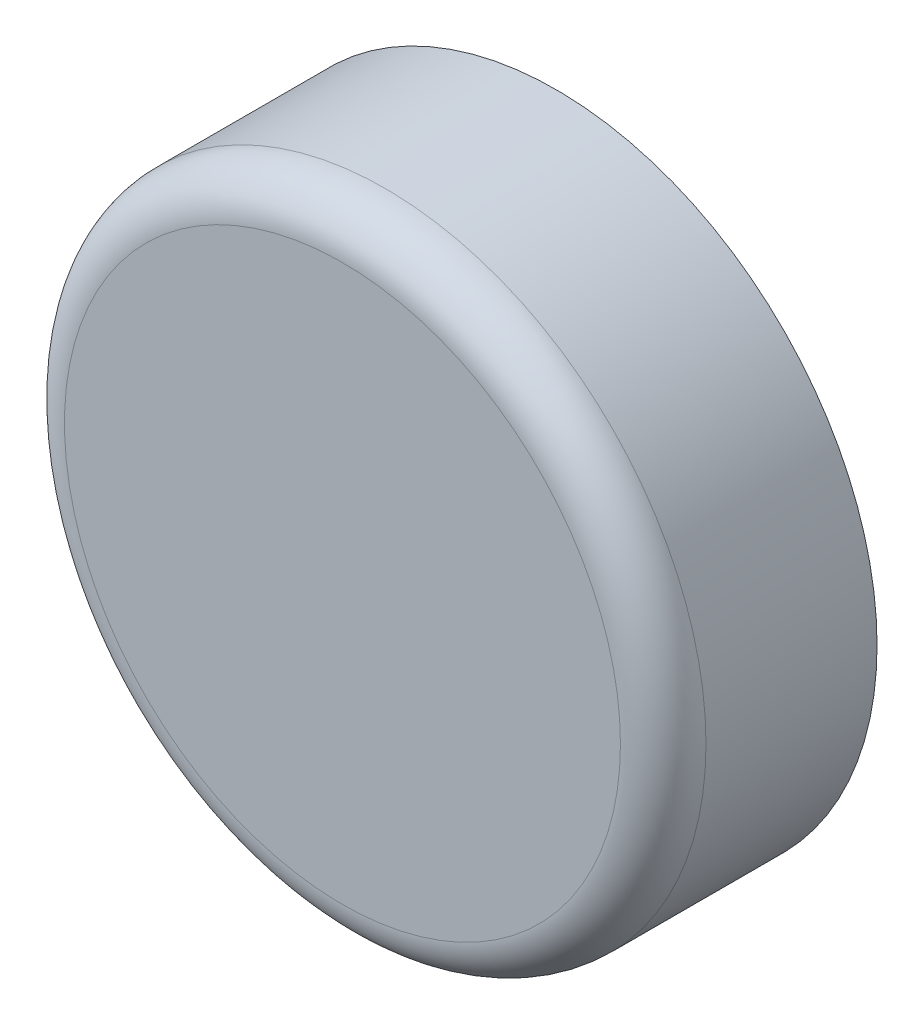
ISO-10303-21;
HEADER;
FILE_DESCRIPTION(('STEP AP214'),'2;1');
FILE_NAME('part.step','',(''),(''),'','','');
FILE_SCHEMA(('AUTOMOTIVE_DESIGN { 1 0 10303 214 1 1 1 1 }'));
ENDSEC;
DATA;
#1=APPLICATION_CONTEXT('core data for automotive mechanical design processes');
#2=APPLICATION_PROTOCOL_DEFINITION('international standard','automotive_design',2000,#1);
#3=PRODUCT_CONTEXT('',#1,'mechanical');
#4=PRODUCT('Part','Part','',(#3));
#5=PRODUCT_RELATED_PRODUCT_CATEGORY('part','',(#4));
#6=PRODUCT_DEFINITION_FORMATION('','',#4);
#7=PRODUCT_DEFINITION_CONTEXT('part definition',#1,'design');
#8=PRODUCT_DEFINITION('design','',#6,#7);
#9=PRODUCT_DEFINITION_SHAPE('','',#8);
#10=(LENGTH_UNIT() NAMED_UNIT(*) SI_UNIT(.MILLI.,.METRE.));
#11=(NAMED_UNIT(*) PLANE_ANGLE_UNIT() SI_UNIT($,.RADIAN.));
#12=(NAMED_UNIT(*) SI_UNIT($,.STERADIAN.) SOLID_ANGLE_UNIT());
#13=UNCERTAINTY_MEASURE_WITH_UNIT(LENGTH_MEASURE(1.E-05),#10,'distance_accuracy_value','');
#14=(GEOMETRIC_REPRESENTATION_CONTEXT(3) GLOBAL_UNCERTAINTY_ASSIGNED_CONTEXT((#13)) GLOBAL_UNIT_ASSIGNED_CONTEXT((#10,
#11,#12)) REPRESENTATION_CONTEXT('',''));
#15=CARTESIAN_POINT('',(0.,0.,0.));
#16=DIRECTION('',(0.,0.,1.));
#17=DIRECTION('',(1.,0.,0.));
#18=AXIS2_PLACEMENT_3D('',#15,#16,#17);
#19=CARTESIAN_POINT('',(0.,0.,10.));
#20=DIRECTION('',(0.,0.,-1.));
#21=DIRECTION('',(-1.,0.,0.));
#22=AXIS2_PLACEMENT_3D('',#19,#20,#21);
#23=CYLINDRICAL_SURFACE('',#22,15.);
#24=CARTESIAN_POINT('',(0.,0.,8.));
#25=DIRECTION('',(0.,0.,1.));
#26=DIRECTION('',(1.,0.,0.));
#27=AXIS2_PLACEMENT_3D('',#24,#25,#26);
#28=CIRCLE('',#27,15.);
#29=CARTESIAN_POINT('',(15.,0.,8.));
#30=VERTEX_POINT('',#29);
#31=EDGE_CURVE('E10',#30,#30,#28,.F.);
#32=ORIENTED_EDGE('',*,*,#31,.T.);
#33=EDGE_LOOP('',(#32));
#34=FACE_BOUND('',#33,.T.);
#35=CARTESIAN_POINT('',(0.,0.,0.));
#36=DIRECTION('',(0.,0.,1.));
#37=DIRECTION('',(1.,0.,0.));
#38=AXIS2_PLACEMENT_3D('',#35,#36,#37);
#39=CIRCLE('',#38,15.);
#40=CARTESIAN_POINT('',(15.,0.,0.));
#41=VERTEX_POINT('',#40);
#42=EDGE_CURVE('E50',#41,#41,#39,.T.);
#43=ORIENTED_EDGE('',*,*,#42,.T.);
#44=EDGE_LOOP('',(#43));
#45=FACE_BOUND('',#44,.T.);
#46=ADVANCED_FACE('F37',(#34,#45),#23,.T.);
#47=CARTESIAN_POINT('',(0.,0.,10.));
#48=DIRECTION('',(0.,0.,1.));
#49=DIRECTION('',(1.,0.,0.));
#50=AXIS2_PLACEMENT_3D('',#47,#48,#49);
#51=PLANE('',#50);
#52=CARTESIAN_POINT('',(0.,0.,10.));
#53=DIRECTION('',(0.,0.,1.));
#54=DIRECTION('',(1.,0.,0.));
#55=AXIS2_PLACEMENT_3D('',#52,#53,#54);
#56=CIRCLE('',#55,13.);
#57=CARTESIAN_POINT('',(13.,0.,10.));
#58=VERTEX_POINT('',#57);
#59=EDGE_CURVE('E45',#58,#58,#56,.T.);
#60=ORIENTED_EDGE('',*,*,#59,.T.);
#61=EDGE_LOOP('',(#60));
#62=FACE_BOUND('',#61,.T.);
#63=ADVANCED_FACE('F61',(#62),#51,.T.);
#64=CARTESIAN_POINT('',(0.,0.,0.));
#65=DIRECTION('',(0.,0.,1.));
#66=DIRECTION('',(1.,0.,0.));
#67=AXIS2_PLACEMENT_3D('',#64,#65,#66);
#68=PLANE('',#67);
#69=ORIENTED_EDGE('',*,*,#42,.F.);
#70=EDGE_LOOP('',(#69));
#71=FACE_BOUND('',#70,.T.);
#72=ADVANCED_FACE('F59',(#71),#68,.F.);
#73=CARTESIAN_POINT('',(0.,0.,8.));
#74=DIRECTION('',(0.,0.,1.));
#75=DIRECTION('',(1.,0.,0.));
#76=AXIS2_PLACEMENT_3D('',#73,#74,#75);
#77=TOROIDAL_SURFACE('',#76,13.,2.);
#78=ORIENTED_EDGE('',*,*,#31,.F.);
#79=EDGE_LOOP('',(#78));
#80=FACE_BOUND('',#79,.T.);
#81=ORIENTED_EDGE('',*,*,#59,.F.);
#82=EDGE_LOOP('',(#81));
#83=FACE_BOUND('',#82,.T.);
#84=ADVANCED_FACE('F39',(#80,#83),#77,.T.);
#85=CLOSED_SHELL('',(#46,#63,#72,#84));
#86=MANIFOLD_SOLID_BREP('B2',#85);
#87=ADVANCED_BREP_SHAPE_REPRESENTATION('',(#18,#86),#14);
#88=SHAPE_DEFINITION_REPRESENTATION(#9,#87);
ENDSEC;
END-ISO-10303-21;
